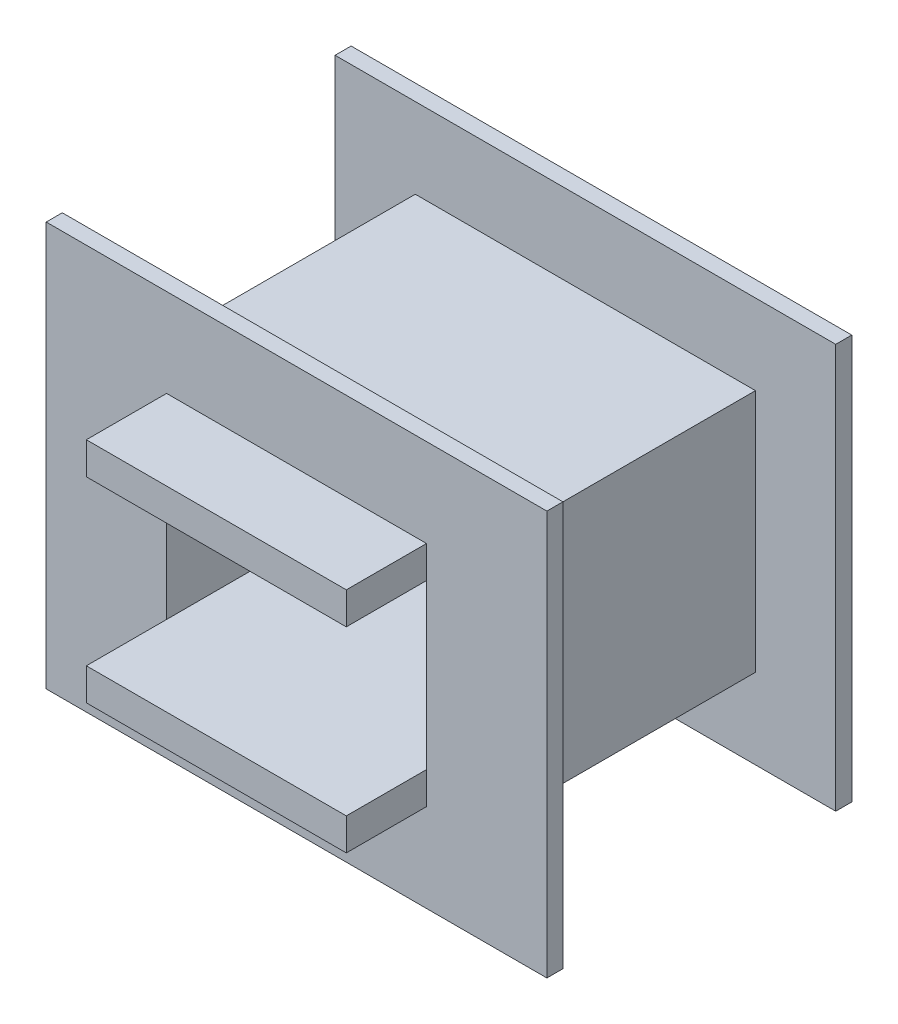
ISO-10303-21;
HEADER;
FILE_DESCRIPTION(('STEP AP214'),'2;1');
FILE_NAME('part.step','',(''),(''),'','','');
FILE_SCHEMA(('AUTOMOTIVE_DESIGN { 1 0 10303 214 1 1 1 1 }'));
ENDSEC;
DATA;
#1=APPLICATION_CONTEXT('core data for automotive mechanical design processes');
#2=APPLICATION_PROTOCOL_DEFINITION('international standard','automotive_design',2000,#1);
#3=PRODUCT_CONTEXT('',#1,'mechanical');
#4=PRODUCT('Part','Part','',(#3));
#5=PRODUCT_RELATED_PRODUCT_CATEGORY('part','',(#4));
#6=PRODUCT_DEFINITION_FORMATION('','',#4);
#7=PRODUCT_DEFINITION_CONTEXT('part definition',#1,'design');
#8=PRODUCT_DEFINITION('design','',#6,#7);
#9=PRODUCT_DEFINITION_SHAPE('','',#8);
#10=(LENGTH_UNIT() NAMED_UNIT(*) SI_UNIT(.MILLI.,.METRE.));
#11=(NAMED_UNIT(*) PLANE_ANGLE_UNIT() SI_UNIT($,.RADIAN.));
#12=(NAMED_UNIT(*) SI_UNIT($,.STERADIAN.) SOLID_ANGLE_UNIT());
#13=UNCERTAINTY_MEASURE_WITH_UNIT(LENGTH_MEASURE(1.E-05),#10,'distance_accuracy_value','');
#14=(GEOMETRIC_REPRESENTATION_CONTEXT(3) GLOBAL_UNCERTAINTY_ASSIGNED_CONTEXT((#13)) GLOBAL_UNIT_ASSIGNED_CONTEXT((#10,
#11,#12)) REPRESENTATION_CONTEXT('',''));
#15=CARTESIAN_POINT('',(0.,0.,0.));
#16=DIRECTION('',(0.,0.,1.));
#17=DIRECTION('',(1.,0.,0.));
#18=AXIS2_PLACEMENT_3D('',#15,#16,#17);
#19=CARTESIAN_POINT('',(-15.6,-12.6,9.5));
#20=DIRECTION('',(0.,0.,1.));
#21=DIRECTION('',(1.,0.,0.));
#22=AXIS2_PLACEMENT_3D('',#19,#20,#21);
#23=PLANE('',#22);
#24=DIRECTION('',(0.,-1.,0.));
#25=VECTOR('',#24,1.);
#26=CARTESIAN_POINT('',(-15.6,12.6,9.5));
#27=LINE('',#26,#25);
#28=CARTESIAN_POINT('',(-15.6,12.6,9.5));
#29=VERTEX_POINT('',#28);
#30=CARTESIAN_POINT('',(-15.6,-12.6,9.5));
#31=VERTEX_POINT('',#30);
#32=EDGE_CURVE('E274',#29,#31,#27,.T.);
#33=ORIENTED_EDGE('',*,*,#32,.T.);
#34=DIRECTION('',(1.,0.,0.));
#35=VECTOR('',#34,1.);
#36=CARTESIAN_POINT('',(-15.6,-12.6,9.5));
#37=LINE('',#36,#35);
#38=CARTESIAN_POINT('',(15.6,-12.6,9.5));
#39=VERTEX_POINT('',#38);
#40=EDGE_CURVE('E277',#31,#39,#37,.T.);
#41=ORIENTED_EDGE('',*,*,#40,.T.);
#42=DIRECTION('',(0.,1.,0.));
#43=VECTOR('',#42,1.);
#44=CARTESIAN_POINT('',(15.6,-12.6,9.5));
#45=LINE('',#44,#43);
#46=CARTESIAN_POINT('',(15.6,12.6,9.5));
#47=VERTEX_POINT('',#46);
#48=EDGE_CURVE('E232',#39,#47,#45,.T.);
#49=ORIENTED_EDGE('',*,*,#48,.T.);
#50=DIRECTION('',(-1.,0.,0.));
#51=VECTOR('',#50,1.);
#52=CARTESIAN_POINT('',(15.6,12.6,9.5));
#53=LINE('',#52,#51);
#54=EDGE_CURVE('E228',#47,#29,#53,.T.);
#55=ORIENTED_EDGE('',*,*,#54,.T.);
#56=EDGE_LOOP('',(#33,#41,#49,#55));
#57=FACE_BOUND('',#56,.T.);
#58=DIRECTION('',(0.,1.,0.));
#59=VECTOR('',#58,1.);
#60=CARTESIAN_POINT('',(8.1,-5.1,9.5));
#61=LINE('',#60,#59);
#62=CARTESIAN_POINT('',(8.1,-5.1,9.5));
#63=VERTEX_POINT('',#62);
#64=CARTESIAN_POINT('',(8.1,5.1,9.5));
#65=VERTEX_POINT('',#64);
#66=EDGE_CURVE('E285',#63,#65,#61,.T.);
#67=ORIENTED_EDGE('',*,*,#66,.F.);
#68=DIRECTION('',(0.,1.,0.));
#69=VECTOR('',#68,1.);
#70=CARTESIAN_POINT('',(8.1,-5.1,9.5));
#71=LINE('',#70,#69);
#72=CARTESIAN_POINT('',(8.1,-7.1,9.5));
#73=VERTEX_POINT('',#72);
#74=EDGE_CURVE('E327',#73,#63,#71,.T.);
#75=ORIENTED_EDGE('',*,*,#74,.F.);
#76=DIRECTION('',(1.,0.,0.));
#77=VECTOR('',#76,1.);
#78=CARTESIAN_POINT('',(8.1,-7.1,9.5));
#79=LINE('',#78,#77);
#80=CARTESIAN_POINT('',(-8.1,-7.1,9.5));
#81=VERTEX_POINT('',#80);
#82=EDGE_CURVE('E324',#81,#73,#79,.T.);
#83=ORIENTED_EDGE('',*,*,#82,.F.);
#84=DIRECTION('',(0.,-1.,0.));
#85=VECTOR('',#84,1.);
#86=CARTESIAN_POINT('',(-8.1,-5.1,9.5));
#87=LINE('',#86,#85);
#88=CARTESIAN_POINT('',(-8.1,-5.1,9.5));
#89=VERTEX_POINT('',#88);
#90=EDGE_CURVE('E322',#89,#81,#87,.T.);
#91=ORIENTED_EDGE('',*,*,#90,.F.);
#92=DIRECTION('',(0.,-1.,0.));
#93=VECTOR('',#92,1.);
#94=CARTESIAN_POINT('',(-8.1,5.1,9.5));
#95=LINE('',#94,#93);
#96=CARTESIAN_POINT('',(-8.1,5.1,9.5));
#97=VERTEX_POINT('',#96);
#98=EDGE_CURVE('E288',#97,#89,#95,.T.);
#99=ORIENTED_EDGE('',*,*,#98,.F.);
#100=DIRECTION('',(0.,-1.,0.));
#101=VECTOR('',#100,1.);
#102=CARTESIAN_POINT('',(-8.1,5.1,9.5));
#103=LINE('',#102,#101);
#104=CARTESIAN_POINT('',(-8.1,7.1,9.5));
#105=VERTEX_POINT('',#104);
#106=EDGE_CURVE('E318',#105,#97,#103,.T.);
#107=ORIENTED_EDGE('',*,*,#106,.F.);
#108=DIRECTION('',(-1.,0.,0.));
#109=VECTOR('',#108,1.);
#110=CARTESIAN_POINT('',(-8.1,7.1,9.5));
#111=LINE('',#110,#109);
#112=CARTESIAN_POINT('',(8.1,7.1,9.5));
#113=VERTEX_POINT('',#112);
#114=EDGE_CURVE('E382',#113,#105,#111,.T.);
#115=ORIENTED_EDGE('',*,*,#114,.F.);
#116=DIRECTION('',(0.,1.,0.));
#117=VECTOR('',#116,1.);
#118=CARTESIAN_POINT('',(8.1,5.1,9.5));
#119=LINE('',#118,#117);
#120=EDGE_CURVE('E390',#65,#113,#119,.T.);
#121=ORIENTED_EDGE('',*,*,#120,.F.);
#122=EDGE_LOOP('',(#67,#75,#83,#91,#99,#107,#115,#121));
#123=FACE_BOUND('',#122,.T.);
#124=ADVANCED_FACE('F31',(#57,#123),#23,.T.);
#125=CARTESIAN_POINT('',(-15.6,7.6,8.50000000000001));
#126=DIRECTION('',(0.,1.,0.));
#127=DIRECTION('',(-1.,0.,0.));
#128=AXIS2_PLACEMENT_3D('',#125,#126,#127);
#129=PLANE('',#128);
#130=DIRECTION('',(-1.,0.,0.));
#131=VECTOR('',#130,1.);
#132=CARTESIAN_POINT('',(-15.6,7.6,-8.5));
#133=LINE('',#132,#131);
#134=CARTESIAN_POINT('',(10.6,7.6,-8.5));
#135=VERTEX_POINT('',#134);
#136=CARTESIAN_POINT('',(-10.6,7.6,-8.5));
#137=VERTEX_POINT('',#136);
#138=EDGE_CURVE('E307',#135,#137,#133,.T.);
#139=ORIENTED_EDGE('',*,*,#138,.T.);
#140=DIRECTION('',(0.,0.,1.));
#141=VECTOR('',#140,1.);
#142=CARTESIAN_POINT('',(-10.6,7.6,8.50000000000001));
#143=LINE('',#142,#141);
#144=CARTESIAN_POINT('',(-10.6,7.6,8.50000000000001));
#145=VERTEX_POINT('',#144);
#146=EDGE_CURVE('E406',#137,#145,#143,.T.);
#147=ORIENTED_EDGE('',*,*,#146,.T.);
#148=DIRECTION('',(1.,0.,0.));
#149=VECTOR('',#148,1.);
#150=CARTESIAN_POINT('',(-15.6,7.6,8.50000000000001));
#151=LINE('',#150,#149);
#152=CARTESIAN_POINT('',(10.6,7.6,8.50000000000001));
#153=VERTEX_POINT('',#152);
#154=EDGE_CURVE('E302',#145,#153,#151,.T.);
#155=ORIENTED_EDGE('',*,*,#154,.T.);
#156=DIRECTION('',(0.,0.,1.));
#157=VECTOR('',#156,1.);
#158=CARTESIAN_POINT('',(10.6,7.6,8.50000000000001));
#159=LINE('',#158,#157);
#160=EDGE_CURVE('E422',#135,#153,#159,.T.);
#161=ORIENTED_EDGE('',*,*,#160,.F.);
#162=EDGE_LOOP('',(#139,#147,#155,#161));
#163=FACE_BOUND('',#162,.T.);
#164=ADVANCED_FACE('F436',(#163),#129,.T.);
#165=CARTESIAN_POINT('',(-15.6,-7.6,8.50000000000001));
#166=DIRECTION('',(0.,-1.,0.));
#167=DIRECTION('',(-1.,0.,0.));
#168=AXIS2_PLACEMENT_3D('',#165,#166,#167);
#169=PLANE('',#168);
#170=DIRECTION('',(1.,0.,0.));
#171=VECTOR('',#170,1.);
#172=CARTESIAN_POINT('',(-15.6,-7.6,8.50000000000001));
#173=LINE('',#172,#171);
#174=CARTESIAN_POINT('',(-10.6,-7.6,8.50000000000001));
#175=VERTEX_POINT('',#174);
#176=CARTESIAN_POINT('',(10.6,-7.6,8.50000000000001));
#177=VERTEX_POINT('',#176);
#178=EDGE_CURVE('E300',#175,#177,#173,.T.);
#179=ORIENTED_EDGE('',*,*,#178,.F.);
#180=DIRECTION('',(0.,0.,-1.));
#181=VECTOR('',#180,1.);
#182=CARTESIAN_POINT('',(-10.6,-7.6,8.50000000000001));
#183=LINE('',#182,#181);
#184=CARTESIAN_POINT('',(-10.6,-7.6,-8.5));
#185=VERTEX_POINT('',#184);
#186=EDGE_CURVE('E411',#175,#185,#183,.T.);
#187=ORIENTED_EDGE('',*,*,#186,.T.);
#188=DIRECTION('',(-1.,0.,0.));
#189=VECTOR('',#188,1.);
#190=CARTESIAN_POINT('',(-15.6,-7.6,-8.5));
#191=LINE('',#190,#189);
#192=CARTESIAN_POINT('',(10.6,-7.6,-8.5));
#193=VERTEX_POINT('',#192);
#194=EDGE_CURVE('E304',#193,#185,#191,.T.);
#195=ORIENTED_EDGE('',*,*,#194,.F.);
#196=DIRECTION('',(0.,0.,-1.));
#197=VECTOR('',#196,1.);
#198=CARTESIAN_POINT('',(10.6,-7.6,8.50000000000001));
#199=LINE('',#198,#197);
#200=EDGE_CURVE('E417',#177,#193,#199,.T.);
#201=ORIENTED_EDGE('',*,*,#200,.F.);
#202=EDGE_LOOP('',(#179,#187,#195,#201));
#203=FACE_BOUND('',#202,.T.);
#204=ADVANCED_FACE('F448',(#203),#169,.T.);
#205=CARTESIAN_POINT('',(-15.6,12.6,-9.5));
#206=DIRECTION('',(-1.,0.,0.));
#207=DIRECTION('',(0.,0.,1.));
#208=AXIS2_PLACEMENT_3D('',#205,#206,#207);
#209=PLANE('',#208);
#210=DIRECTION('',(0.,1.,0.));
#211=VECTOR('',#210,1.);
#212=CARTESIAN_POINT('',(-15.6,7.6,8.50000000000001));
#213=LINE('',#212,#211);
#214=CARTESIAN_POINT('',(-15.6,-12.6,8.50000000000001));
#215=VERTEX_POINT('',#214);
#216=CARTESIAN_POINT('',(-15.6,12.6,8.50000000000001));
#217=VERTEX_POINT('',#216);
#218=EDGE_CURVE('E275',#215,#217,#213,.T.);
#219=ORIENTED_EDGE('',*,*,#218,.F.);
#220=DIRECTION('',(0.,0.,1.));
#221=VECTOR('',#220,1.);
#222=CARTESIAN_POINT('',(-15.6,-12.6,-9.5));
#223=LINE('',#222,#221);
#224=EDGE_CURVE('E251',#215,#31,#223,.T.);
#225=ORIENTED_EDGE('',*,*,#224,.T.);
#226=ORIENTED_EDGE('',*,*,#32,.F.);
#227=DIRECTION('',(0.,0.,1.));
#228=VECTOR('',#227,1.);
#229=CARTESIAN_POINT('',(-15.6,12.6,-9.5));
#230=LINE('',#229,#228);
#231=EDGE_CURVE('E40',#217,#29,#230,.T.);
#232=ORIENTED_EDGE('',*,*,#231,.F.);
#233=EDGE_LOOP('',(#219,#225,#226,#232));
#234=FACE_BOUND('',#233,.T.);
#235=ADVANCED_FACE('F33',(#234),#209,.T.);
#236=CARTESIAN_POINT('',(-15.6,-12.6,-9.5));
#237=VERTEX_POINT('',#236);
#238=CARTESIAN_POINT('',(-15.6,-12.6,-8.5));
#239=VERTEX_POINT('',#238);
#240=EDGE_CURVE('E35',#237,#239,#223,.T.);
#241=ORIENTED_EDGE('',*,*,#240,.T.);
#242=DIRECTION('',(0.,1.,0.));
#243=VECTOR('',#242,1.);
#244=CARTESIAN_POINT('',(-15.6,7.6,-8.5));
#245=LINE('',#244,#243);
#246=CARTESIAN_POINT('',(-15.6,12.6,-8.5));
#247=VERTEX_POINT('',#246);
#248=EDGE_CURVE('E310',#239,#247,#245,.T.);
#249=ORIENTED_EDGE('',*,*,#248,.T.);
#250=CARTESIAN_POINT('',(-15.6,12.6,-9.5));
#251=VERTEX_POINT('',#250);
#252=EDGE_CURVE('E11',#251,#247,#230,.T.);
#253=ORIENTED_EDGE('',*,*,#252,.F.);
#254=DIRECTION('',(0.,-1.,0.));
#255=VECTOR('',#254,1.);
#256=CARTESIAN_POINT('',(-15.6,12.6,-9.5));
#257=LINE('',#256,#255);
#258=EDGE_CURVE('E222',#251,#237,#257,.T.);
#259=ORIENTED_EDGE('',*,*,#258,.T.);
#260=EDGE_LOOP('',(#241,#249,#253,#259));
#261=FACE_BOUND('',#260,.T.);
#262=ADVANCED_FACE('F506',(#261),#209,.T.);
#263=CARTESIAN_POINT('',(15.6,-12.6,-9.5));
#264=DIRECTION('',(1.,0.,0.));
#265=DIRECTION('',(0.,0.,-1.));
#266=AXIS2_PLACEMENT_3D('',#263,#264,#265);
#267=PLANE('',#266);
#268=DIRECTION('',(0.,0.,1.));
#269=VECTOR('',#268,1.);
#270=CARTESIAN_POINT('',(15.6,-12.6,-9.5));
#271=LINE('',#270,#269);
#272=CARTESIAN_POINT('',(15.6,-12.6,8.50000000000001));
#273=VERTEX_POINT('',#272);
#274=EDGE_CURVE('E258',#273,#39,#271,.T.);
#275=ORIENTED_EDGE('',*,*,#274,.F.);
#276=DIRECTION('',(0.,1.,0.));
#277=VECTOR('',#276,1.);
#278=CARTESIAN_POINT('',(15.6,7.6,8.50000000000001));
#279=LINE('',#278,#277);
#280=CARTESIAN_POINT('',(15.6,12.6,8.50000000000001));
#281=VERTEX_POINT('',#280);
#282=EDGE_CURVE('E314',#273,#281,#279,.T.);
#283=ORIENTED_EDGE('',*,*,#282,.T.);
#284=DIRECTION('',(0.,0.,1.));
#285=VECTOR('',#284,1.);
#286=CARTESIAN_POINT('',(15.6,12.6,-9.5));
#287=LINE('',#286,#285);
#288=EDGE_CURVE('E255',#281,#47,#287,.T.);
#289=ORIENTED_EDGE('',*,*,#288,.T.);
#290=ORIENTED_EDGE('',*,*,#48,.F.);
#291=EDGE_LOOP('',(#275,#283,#289,#290));
#292=FACE_BOUND('',#291,.T.);
#293=ADVANCED_FACE('F486',(#292),#267,.T.);
#294=DIRECTION('',(0.,1.,0.));
#295=VECTOR('',#294,1.);
#296=CARTESIAN_POINT('',(15.6,7.6,-8.5));
#297=LINE('',#296,#295);
#298=CARTESIAN_POINT('',(15.6,-12.6,-8.5));
#299=VERTEX_POINT('',#298);
#300=CARTESIAN_POINT('',(15.6,12.6,-8.5));
#301=VERTEX_POINT('',#300);
#302=EDGE_CURVE('E312',#299,#301,#297,.T.);
#303=ORIENTED_EDGE('',*,*,#302,.F.);
#304=CARTESIAN_POINT('',(15.6,-12.6,-9.5));
#305=VERTEX_POINT('',#304);
#306=EDGE_CURVE('E256',#305,#299,#271,.T.);
#307=ORIENTED_EDGE('',*,*,#306,.F.);
#308=DIRECTION('',(0.,1.,0.));
#309=VECTOR('',#308,1.);
#310=CARTESIAN_POINT('',(15.6,-12.6,-9.5));
#311=LINE('',#310,#309);
#312=CARTESIAN_POINT('',(15.6,12.6,-9.5));
#313=VERTEX_POINT('',#312);
#314=EDGE_CURVE('E246',#305,#313,#311,.T.);
#315=ORIENTED_EDGE('',*,*,#314,.T.);
#316=EDGE_CURVE('E253',#313,#301,#287,.T.);
#317=ORIENTED_EDGE('',*,*,#316,.T.);
#318=EDGE_LOOP('',(#303,#307,#315,#317));
#319=FACE_BOUND('',#318,.T.);
#320=ADVANCED_FACE('F484',(#319),#267,.T.);
#321=CARTESIAN_POINT('',(-15.6,-12.6,-9.5));
#322=DIRECTION('',(0.,-1.,0.));
#323=DIRECTION('',(1.,0.,0.));
#324=AXIS2_PLACEMENT_3D('',#321,#322,#323);
#325=PLANE('',#324);
#326=ORIENTED_EDGE('',*,*,#224,.F.);
#327=DIRECTION('',(1.,0.,0.));
#328=VECTOR('',#327,1.);
#329=CARTESIAN_POINT('',(-15.6,-12.6,8.50000000000001));
#330=LINE('',#329,#328);
#331=EDGE_CURVE('E427',#215,#273,#330,.T.);
#332=ORIENTED_EDGE('',*,*,#331,.T.);
#333=ORIENTED_EDGE('',*,*,#274,.T.);
#334=ORIENTED_EDGE('',*,*,#40,.F.);
#335=EDGE_LOOP('',(#326,#332,#333,#334));
#336=FACE_BOUND('',#335,.T.);
#337=ADVANCED_FACE('F278',(#336),#325,.T.);
#338=ORIENTED_EDGE('',*,*,#306,.T.);
#339=DIRECTION('',(-1.,0.,0.));
#340=VECTOR('',#339,1.);
#341=CARTESIAN_POINT('',(-15.6,-12.6,-8.5));
#342=LINE('',#341,#340);
#343=EDGE_CURVE('E425',#299,#239,#342,.T.);
#344=ORIENTED_EDGE('',*,*,#343,.T.);
#345=ORIENTED_EDGE('',*,*,#240,.F.);
#346=DIRECTION('',(1.,0.,0.));
#347=VECTOR('',#346,1.);
#348=CARTESIAN_POINT('',(-15.6,-12.6,-9.5));
#349=LINE('',#348,#347);
#350=EDGE_CURVE('E243',#237,#305,#349,.T.);
#351=ORIENTED_EDGE('',*,*,#350,.T.);
#352=EDGE_LOOP('',(#338,#344,#345,#351));
#353=FACE_BOUND('',#352,.T.);
#354=ADVANCED_FACE('F489',(#353),#325,.T.);
#355=CARTESIAN_POINT('',(15.6,12.6,-9.5));
#356=DIRECTION('',(0.,1.,0.));
#357=DIRECTION('',(-1.,0.,0.));
#358=AXIS2_PLACEMENT_3D('',#355,#356,#357);
#359=PLANE('',#358);
#360=DIRECTION('',(-1.,0.,0.));
#361=VECTOR('',#360,1.);
#362=CARTESIAN_POINT('',(-15.6,12.6,-8.5));
#363=LINE('',#362,#361);
#364=EDGE_CURVE('E299',#301,#247,#363,.T.);
#365=ORIENTED_EDGE('',*,*,#364,.F.);
#366=ORIENTED_EDGE('',*,*,#316,.F.);
#367=DIRECTION('',(-1.,0.,0.));
#368=VECTOR('',#367,1.);
#369=CARTESIAN_POINT('',(15.6,12.6,-9.5));
#370=LINE('',#369,#368);
#371=EDGE_CURVE('E249',#313,#251,#370,.T.);
#372=ORIENTED_EDGE('',*,*,#371,.T.);
#373=ORIENTED_EDGE('',*,*,#252,.T.);
#374=EDGE_LOOP('',(#365,#366,#372,#373));
#375=FACE_BOUND('',#374,.T.);
#376=ADVANCED_FACE('F483',(#375),#359,.T.);
#377=DIRECTION('',(1.,0.,0.));
#378=VECTOR('',#377,1.);
#379=CARTESIAN_POINT('',(-15.6,12.6,8.50000000000001));
#380=LINE('',#379,#378);
#381=EDGE_CURVE('E296',#217,#281,#380,.T.);
#382=ORIENTED_EDGE('',*,*,#381,.F.);
#383=ORIENTED_EDGE('',*,*,#231,.T.);
#384=ORIENTED_EDGE('',*,*,#54,.F.);
#385=ORIENTED_EDGE('',*,*,#288,.F.);
#386=EDGE_LOOP('',(#382,#383,#384,#385));
#387=FACE_BOUND('',#386,.T.);
#388=ADVANCED_FACE('F295',(#387),#359,.T.);
#389=CARTESIAN_POINT('',(-15.6,-12.6,-9.5));
#390=DIRECTION('',(0.,0.,1.));
#391=DIRECTION('',(1.,0.,0.));
#392=AXIS2_PLACEMENT_3D('',#389,#390,#391);
#393=PLANE('',#392);
#394=DIRECTION('',(1.,0.,0.));
#395=VECTOR('',#394,1.);
#396=CARTESIAN_POINT('',(-8.1,5.1,-9.5));
#397=LINE('',#396,#395);
#398=CARTESIAN_POINT('',(-8.1,5.1,-9.5));
#399=VERTEX_POINT('',#398);
#400=CARTESIAN_POINT('',(8.1,5.1,-9.5));
#401=VERTEX_POINT('',#400);
#402=EDGE_CURVE('E199',#399,#401,#397,.T.);
#403=ORIENTED_EDGE('',*,*,#402,.F.);
#404=DIRECTION('',(0.,-1.,0.));
#405=VECTOR('',#404,1.);
#406=CARTESIAN_POINT('',(-8.1,5.1,-9.5));
#407=LINE('',#406,#405);
#408=CARTESIAN_POINT('',(-8.1,-5.1,-9.5));
#409=VERTEX_POINT('',#408);
#410=EDGE_CURVE('E204',#399,#409,#407,.T.);
#411=ORIENTED_EDGE('',*,*,#410,.T.);
#412=DIRECTION('',(0.,-1.,0.));
#413=VECTOR('',#412,1.);
#414=CARTESIAN_POINT('',(-8.1,-5.1,-9.5));
#415=LINE('',#414,#413);
#416=CARTESIAN_POINT('',(-8.1,-7.1,-9.5));
#417=VERTEX_POINT('',#416);
#418=EDGE_CURVE('E53',#409,#417,#415,.T.);
#419=ORIENTED_EDGE('',*,*,#418,.T.);
#420=DIRECTION('',(1.,0.,0.));
#421=VECTOR('',#420,1.);
#422=CARTESIAN_POINT('',(8.1,-7.1,-9.5));
#423=LINE('',#422,#421);
#424=CARTESIAN_POINT('',(8.1,-7.1,-9.5));
#425=VERTEX_POINT('',#424);
#426=EDGE_CURVE('E48',#417,#425,#423,.T.);
#427=ORIENTED_EDGE('',*,*,#426,.T.);
#428=DIRECTION('',(0.,1.,0.));
#429=VECTOR('',#428,1.);
#430=CARTESIAN_POINT('',(8.1,-5.1,-9.5));
#431=LINE('',#430,#429);
#432=CARTESIAN_POINT('',(8.1,-5.1,-9.5));
#433=VERTEX_POINT('',#432);
#434=EDGE_CURVE('E211',#425,#433,#431,.T.);
#435=ORIENTED_EDGE('',*,*,#434,.T.);
#436=DIRECTION('',(0.,1.,0.));
#437=VECTOR('',#436,1.);
#438=CARTESIAN_POINT('',(8.1,-5.1,-9.5));
#439=LINE('',#438,#437);
#440=EDGE_CURVE('E207',#433,#401,#439,.T.);
#441=ORIENTED_EDGE('',*,*,#440,.T.);
#442=EDGE_LOOP('',(#403,#411,#419,#427,#435,#441));
#443=FACE_BOUND('',#442,.T.);
#444=ORIENTED_EDGE('',*,*,#258,.F.);
#445=ORIENTED_EDGE('',*,*,#371,.F.);
#446=ORIENTED_EDGE('',*,*,#314,.F.);
#447=ORIENTED_EDGE('',*,*,#350,.F.);
#448=EDGE_LOOP('',(#444,#445,#446,#447));
#449=FACE_BOUND('',#448,.T.);
#450=ADVANCED_FACE('F201',(#443,#449),#393,.F.);
#451=CARTESIAN_POINT('',(-8.1,5.1,-9.5));
#452=DIRECTION('',(-1.,0.,0.));
#453=DIRECTION('',(0.,0.,1.));
#454=AXIS2_PLACEMENT_3D('',#451,#452,#453);
#455=PLANE('',#454);
#456=DIRECTION('',(0.,0.,1.));
#457=VECTOR('',#456,1.);
#458=CARTESIAN_POINT('',(-8.1,5.1,-9.5));
#459=LINE('',#458,#457);
#460=EDGE_CURVE('E214',#399,#97,#459,.T.);
#461=ORIENTED_EDGE('',*,*,#460,.T.);
#462=ORIENTED_EDGE('',*,*,#98,.T.);
#463=DIRECTION('',(0.,0.,1.));
#464=VECTOR('',#463,1.);
#465=CARTESIAN_POINT('',(-8.1,-5.1,-9.5));
#466=LINE('',#465,#464);
#467=EDGE_CURVE('E227',#409,#89,#466,.T.);
#468=ORIENTED_EDGE('',*,*,#467,.F.);
#469=ORIENTED_EDGE('',*,*,#410,.F.);
#470=EDGE_LOOP('',(#461,#462,#468,#469));
#471=FACE_BOUND('',#470,.T.);
#472=ADVANCED_FACE('F225',(#471),#455,.F.);
#473=CARTESIAN_POINT('',(8.1,5.1,-9.5));
#474=DIRECTION('',(0.,1.,0.));
#475=DIRECTION('',(-1.,0.,0.));
#476=AXIS2_PLACEMENT_3D('',#473,#474,#475);
#477=PLANE('',#476);
#478=ORIENTED_EDGE('',*,*,#460,.F.);
#479=ORIENTED_EDGE('',*,*,#402,.T.);
#480=DIRECTION('',(0.,0.,1.));
#481=VECTOR('',#480,1.);
#482=CARTESIAN_POINT('',(8.1,5.1,-9.5));
#483=LINE('',#482,#481);
#484=EDGE_CURVE('E223',#401,#65,#483,.T.);
#485=ORIENTED_EDGE('',*,*,#484,.T.);
#486=DIRECTION('',(0.,0.,-1.));
#487=VECTOR('',#486,1.);
#488=CARTESIAN_POINT('',(8.1,5.1,14.5));
#489=LINE('',#488,#487);
#490=CARTESIAN_POINT('',(8.1,5.1,14.5));
#491=VERTEX_POINT('',#490);
#492=EDGE_CURVE('E399',#491,#65,#489,.T.);
#493=ORIENTED_EDGE('',*,*,#492,.F.);
#494=DIRECTION('',(1.,0.,0.));
#495=VECTOR('',#494,1.);
#496=CARTESIAN_POINT('',(-8.1,5.1,14.5));
#497=LINE('',#496,#495);
#498=CARTESIAN_POINT('',(-8.1,5.1,14.5));
#499=VERTEX_POINT('',#498);
#500=EDGE_CURVE('E381',#499,#491,#497,.T.);
#501=ORIENTED_EDGE('',*,*,#500,.F.);
#502=DIRECTION('',(0.,0.,-1.));
#503=VECTOR('',#502,1.);
#504=CARTESIAN_POINT('',(-8.1,5.1,14.5));
#505=LINE('',#504,#503);
#506=EDGE_CURVE('E217',#499,#97,#505,.T.);
#507=ORIENTED_EDGE('',*,*,#506,.T.);
#508=EDGE_LOOP('',(#478,#479,#485,#493,#501,#507));
#509=FACE_BOUND('',#508,.T.);
#510=ADVANCED_FACE('F215',(#509),#477,.F.);
#511=CARTESIAN_POINT('',(8.1,-5.1,-9.5));
#512=DIRECTION('',(1.,0.,0.));
#513=DIRECTION('',(0.,0.,-1.));
#514=AXIS2_PLACEMENT_3D('',#511,#512,#513);
#515=PLANE('',#514);
#516=DIRECTION('',(0.,0.,1.));
#517=VECTOR('',#516,1.);
#518=CARTESIAN_POINT('',(8.1,-5.1,-9.5));
#519=LINE('',#518,#517);
#520=EDGE_CURVE('E237',#433,#63,#519,.T.);
#521=ORIENTED_EDGE('',*,*,#520,.T.);
#522=ORIENTED_EDGE('',*,*,#66,.T.);
#523=ORIENTED_EDGE('',*,*,#484,.F.);
#524=ORIENTED_EDGE('',*,*,#440,.F.);
#525=EDGE_LOOP('',(#521,#522,#523,#524));
#526=FACE_BOUND('',#525,.T.);
#527=ADVANCED_FACE('F471',(#526),#515,.F.);
#528=CARTESIAN_POINT('',(-8.1,-5.1,-9.5));
#529=DIRECTION('',(0.,-1.,0.));
#530=DIRECTION('',(1.,0.,0.));
#531=AXIS2_PLACEMENT_3D('',#528,#529,#530);
#532=PLANE('',#531);
#533=ORIENTED_EDGE('',*,*,#467,.T.);
#534=DIRECTION('',(0.,0.,-1.));
#535=VECTOR('',#534,1.);
#536=CARTESIAN_POINT('',(-8.1,-5.1,14.5));
#537=LINE('',#536,#535);
#538=CARTESIAN_POINT('',(-8.1,-5.1,14.5));
#539=VERTEX_POINT('',#538);
#540=EDGE_CURVE('E332',#539,#89,#537,.T.);
#541=ORIENTED_EDGE('',*,*,#540,.F.);
#542=DIRECTION('',(-1.,0.,0.));
#543=VECTOR('',#542,1.);
#544=CARTESIAN_POINT('',(8.1,-5.1,14.5));
#545=LINE('',#544,#543);
#546=CARTESIAN_POINT('',(8.1,-5.1,14.5));
#547=VERTEX_POINT('',#546);
#548=EDGE_CURVE('E361',#547,#539,#545,.T.);
#549=ORIENTED_EDGE('',*,*,#548,.F.);
#550=DIRECTION('',(0.,0.,-1.));
#551=VECTOR('',#550,1.);
#552=CARTESIAN_POINT('',(8.1,-5.1,14.5));
#553=LINE('',#552,#551);
#554=EDGE_CURVE('E376',#547,#63,#553,.T.);
#555=ORIENTED_EDGE('',*,*,#554,.T.);
#556=ORIENTED_EDGE('',*,*,#520,.F.);
#557=DIRECTION('',(0.,0.,1.));
#558=VECTOR('',#557,1.);
#559=CARTESIAN_POINT('',(8.1,-5.1,-14.5));
#560=LINE('',#559,#558);
#561=CARTESIAN_POINT('',(8.1,-5.1,-14.5));
#562=VERTEX_POINT('',#561);
#563=EDGE_CURVE('E342',#562,#433,#560,.T.);
#564=ORIENTED_EDGE('',*,*,#563,.F.);
#565=DIRECTION('',(-1.,0.,0.));
#566=VECTOR('',#565,1.);
#567=CARTESIAN_POINT('',(8.1,-5.1,-14.5));
#568=LINE('',#567,#566);
#569=CARTESIAN_POINT('',(-8.1,-5.1,-14.5));
#570=VERTEX_POINT('',#569);
#571=EDGE_CURVE('E337',#562,#570,#568,.T.);
#572=ORIENTED_EDGE('',*,*,#571,.T.);
#573=DIRECTION('',(0.,0.,1.));
#574=VECTOR('',#573,1.);
#575=CARTESIAN_POINT('',(-8.1,-5.1,-14.5));
#576=LINE('',#575,#574);
#577=EDGE_CURVE('E335',#570,#409,#576,.T.);
#578=ORIENTED_EDGE('',*,*,#577,.T.);
#579=EDGE_LOOP('',(#533,#541,#549,#555,#556,#564,#572,#578));
#580=FACE_BOUND('',#579,.T.);
#581=ADVANCED_FACE('F331',(#580),#532,.F.);
#582=CARTESIAN_POINT('',(-15.6,7.6,-8.5));
#583=DIRECTION('',(0.,0.,-1.));
#584=DIRECTION('',(-1.,0.,0.));
#585=AXIS2_PLACEMENT_3D('',#582,#583,#584);
#586=PLANE('',#585);
#587=ORIENTED_EDGE('',*,*,#248,.F.);
#588=ORIENTED_EDGE('',*,*,#343,.F.);
#589=ORIENTED_EDGE('',*,*,#302,.T.);
#590=ORIENTED_EDGE('',*,*,#364,.T.);
#591=EDGE_LOOP('',(#587,#588,#589,#590));
#592=FACE_BOUND('',#591,.T.);
#593=ORIENTED_EDGE('',*,*,#194,.T.);
#594=DIRECTION('',(0.,1.,0.));
#595=VECTOR('',#594,1.);
#596=CARTESIAN_POINT('',(-10.6,7.6,-8.5));
#597=LINE('',#596,#595);
#598=EDGE_CURVE('E409',#185,#137,#597,.T.);
#599=ORIENTED_EDGE('',*,*,#598,.T.);
#600=ORIENTED_EDGE('',*,*,#138,.F.);
#601=DIRECTION('',(0.,1.,0.));
#602=VECTOR('',#601,1.);
#603=CARTESIAN_POINT('',(10.6,7.6,-8.5));
#604=LINE('',#603,#602);
#605=EDGE_CURVE('E420',#193,#135,#604,.T.);
#606=ORIENTED_EDGE('',*,*,#605,.F.);
#607=EDGE_LOOP('',(#593,#599,#600,#606));
#608=FACE_BOUND('',#607,.T.);
#609=ADVANCED_FACE('F439',(#592,#608),#586,.F.);
#610=CARTESIAN_POINT('',(-15.6,7.6,8.50000000000001));
#611=DIRECTION('',(0.,0.,1.));
#612=DIRECTION('',(1.,0.,0.));
#613=AXIS2_PLACEMENT_3D('',#610,#611,#612);
#614=PLANE('',#613);
#615=DIRECTION('',(0.,-1.,0.));
#616=VECTOR('',#615,1.);
#617=CARTESIAN_POINT('',(-10.6,7.6,8.50000000000001));
#618=LINE('',#617,#616);
#619=EDGE_CURVE('E403',#145,#175,#618,.T.);
#620=ORIENTED_EDGE('',*,*,#619,.T.);
#621=ORIENTED_EDGE('',*,*,#178,.T.);
#622=DIRECTION('',(0.,-1.,0.));
#623=VECTOR('',#622,1.);
#624=CARTESIAN_POINT('',(10.6,7.6,8.50000000000001));
#625=LINE('',#624,#623);
#626=EDGE_CURVE('E414',#153,#177,#625,.T.);
#627=ORIENTED_EDGE('',*,*,#626,.F.);
#628=ORIENTED_EDGE('',*,*,#154,.F.);
#629=EDGE_LOOP('',(#620,#621,#627,#628));
#630=FACE_BOUND('',#629,.T.);
#631=ORIENTED_EDGE('',*,*,#381,.T.);
#632=ORIENTED_EDGE('',*,*,#282,.F.);
#633=ORIENTED_EDGE('',*,*,#331,.F.);
#634=ORIENTED_EDGE('',*,*,#218,.T.);
#635=EDGE_LOOP('',(#631,#632,#633,#634));
#636=FACE_BOUND('',#635,.T.);
#637=ADVANCED_FACE('F445',(#630,#636),#614,.F.);
#638=CARTESIAN_POINT('',(10.6,-7.6,8.50000000000001));
#639=DIRECTION('',(1.,0.,0.));
#640=DIRECTION('',(0.,0.,-1.));
#641=AXIS2_PLACEMENT_3D('',#638,#639,#640);
#642=PLANE('',#641);
#643=ORIENTED_EDGE('',*,*,#626,.T.);
#644=ORIENTED_EDGE('',*,*,#200,.T.);
#645=ORIENTED_EDGE('',*,*,#605,.T.);
#646=ORIENTED_EDGE('',*,*,#160,.T.);
#647=EDGE_LOOP('',(#643,#644,#645,#646));
#648=FACE_BOUND('',#647,.T.);
#649=ADVANCED_FACE('F450',(#648),#642,.T.);
#650=CARTESIAN_POINT('',(-10.6,-7.6,8.50000000000001));
#651=DIRECTION('',(-1.,0.,0.));
#652=DIRECTION('',(0.,0.,-1.));
#653=AXIS2_PLACEMENT_3D('',#650,#651,#652);
#654=PLANE('',#653);
#655=ORIENTED_EDGE('',*,*,#619,.F.);
#656=ORIENTED_EDGE('',*,*,#146,.F.);
#657=ORIENTED_EDGE('',*,*,#598,.F.);
#658=ORIENTED_EDGE('',*,*,#186,.F.);
#659=EDGE_LOOP('',(#655,#656,#657,#658));
#660=FACE_BOUND('',#659,.T.);
#661=ADVANCED_FACE('F442',(#660),#654,.T.);
#662=CARTESIAN_POINT('',(-8.1,5.1,14.5));
#663=DIRECTION('',(1.,0.,0.));
#664=DIRECTION('',(0.,0.,-1.));
#665=AXIS2_PLACEMENT_3D('',#662,#663,#664);
#666=PLANE('',#665);
#667=ORIENTED_EDGE('',*,*,#106,.T.);
#668=ORIENTED_EDGE('',*,*,#506,.F.);
#669=DIRECTION('',(0.,-1.,0.));
#670=VECTOR('',#669,1.);
#671=CARTESIAN_POINT('',(-8.1,5.1,14.5));
#672=LINE('',#671,#670);
#673=CARTESIAN_POINT('',(-8.1,7.1,14.5));
#674=VERTEX_POINT('',#673);
#675=EDGE_CURVE('E378',#674,#499,#672,.T.);
#676=ORIENTED_EDGE('',*,*,#675,.F.);
#677=DIRECTION('',(0.,0.,-1.));
#678=VECTOR('',#677,1.);
#679=CARTESIAN_POINT('',(-8.1,7.1,14.5));
#680=LINE('',#679,#678);
#681=EDGE_CURVE('E388',#674,#105,#680,.T.);
#682=ORIENTED_EDGE('',*,*,#681,.T.);
#683=EDGE_LOOP('',(#667,#668,#676,#682));
#684=FACE_BOUND('',#683,.T.);
#685=ADVANCED_FACE('F457',(#684),#666,.F.);
#686=CARTESIAN_POINT('',(8.1,5.1,14.5));
#687=DIRECTION('',(-1.,0.,0.));
#688=DIRECTION('',(0.,0.,1.));
#689=AXIS2_PLACEMENT_3D('',#686,#687,#688);
#690=PLANE('',#689);
#691=ORIENTED_EDGE('',*,*,#120,.T.);
#692=DIRECTION('',(0.,0.,-1.));
#693=VECTOR('',#692,1.);
#694=CARTESIAN_POINT('',(8.1,7.1,14.5));
#695=LINE('',#694,#693);
#696=CARTESIAN_POINT('',(8.1,7.1,14.5));
#697=VERTEX_POINT('',#696);
#698=EDGE_CURVE('E396',#697,#113,#695,.T.);
#699=ORIENTED_EDGE('',*,*,#698,.F.);
#700=DIRECTION('',(0.,1.,0.));
#701=VECTOR('',#700,1.);
#702=CARTESIAN_POINT('',(8.1,5.1,14.5));
#703=LINE('',#702,#701);
#704=EDGE_CURVE('E384',#491,#697,#703,.T.);
#705=ORIENTED_EDGE('',*,*,#704,.F.);
#706=ORIENTED_EDGE('',*,*,#492,.T.);
#707=EDGE_LOOP('',(#691,#699,#705,#706));
#708=FACE_BOUND('',#707,.T.);
#709=ADVANCED_FACE('F581',(#708),#690,.F.);
#710=CARTESIAN_POINT('',(-8.1,7.1,14.5));
#711=DIRECTION('',(0.,-1.,0.));
#712=DIRECTION('',(0.,0.,-1.));
#713=AXIS2_PLACEMENT_3D('',#710,#711,#712);
#714=PLANE('',#713);
#715=ORIENTED_EDGE('',*,*,#114,.T.);
#716=ORIENTED_EDGE('',*,*,#681,.F.);
#717=DIRECTION('',(-1.,0.,0.));
#718=VECTOR('',#717,1.);
#719=CARTESIAN_POINT('',(-8.1,7.1,14.5));
#720=LINE('',#719,#718);
#721=EDGE_CURVE('E386',#697,#674,#720,.T.);
#722=ORIENTED_EDGE('',*,*,#721,.F.);
#723=ORIENTED_EDGE('',*,*,#698,.T.);
#724=EDGE_LOOP('',(#715,#716,#722,#723));
#725=FACE_BOUND('',#724,.T.);
#726=ADVANCED_FACE('F592',(#725),#714,.F.);
#727=CARTESIAN_POINT('',(-8.1,7.1,14.5));
#728=DIRECTION('',(0.,0.,-1.));
#729=DIRECTION('',(-1.,0.,0.));
#730=AXIS2_PLACEMENT_3D('',#727,#728,#729);
#731=PLANE('',#730);
#732=ORIENTED_EDGE('',*,*,#675,.T.);
#733=ORIENTED_EDGE('',*,*,#500,.T.);
#734=ORIENTED_EDGE('',*,*,#704,.T.);
#735=ORIENTED_EDGE('',*,*,#721,.T.);
#736=EDGE_LOOP('',(#732,#733,#734,#735));
#737=FACE_BOUND('',#736,.T.);
#738=ADVANCED_FACE('F602',(#737),#731,.F.);
#739=CARTESIAN_POINT('',(8.1,-5.1,14.5));
#740=DIRECTION('',(-1.,0.,0.));
#741=DIRECTION('',(0.,0.,1.));
#742=AXIS2_PLACEMENT_3D('',#739,#740,#741);
#743=PLANE('',#742);
#744=ORIENTED_EDGE('',*,*,#74,.T.);
#745=ORIENTED_EDGE('',*,*,#554,.F.);
#746=DIRECTION('',(0.,1.,0.));
#747=VECTOR('',#746,1.);
#748=CARTESIAN_POINT('',(8.1,-5.1,14.5));
#749=LINE('',#748,#747);
#750=CARTESIAN_POINT('',(8.1,-7.1,14.5));
#751=VERTEX_POINT('',#750);
#752=EDGE_CURVE('E358',#751,#547,#749,.T.);
#753=ORIENTED_EDGE('',*,*,#752,.F.);
#754=DIRECTION('',(0.,0.,-1.));
#755=VECTOR('',#754,1.);
#756=CARTESIAN_POINT('',(8.1,-7.1,14.5));
#757=LINE('',#756,#755);
#758=EDGE_CURVE('E367',#751,#73,#757,.T.);
#759=ORIENTED_EDGE('',*,*,#758,.T.);
#760=EDGE_LOOP('',(#744,#745,#753,#759));
#761=FACE_BOUND('',#760,.T.);
#762=ADVANCED_FACE('F612',(#761),#743,.F.);
#763=CARTESIAN_POINT('',(-8.1,-5.1,14.5));
#764=DIRECTION('',(1.,0.,0.));
#765=DIRECTION('',(0.,0.,-1.));
#766=AXIS2_PLACEMENT_3D('',#763,#764,#765);
#767=PLANE('',#766);
#768=ORIENTED_EDGE('',*,*,#90,.T.);
#769=DIRECTION('',(0.,0.,-1.));
#770=VECTOR('',#769,1.);
#771=CARTESIAN_POINT('',(-8.1,-7.1,14.5));
#772=LINE('',#771,#770);
#773=CARTESIAN_POINT('',(-8.1,-7.1,14.5));
#774=VERTEX_POINT('',#773);
#775=EDGE_CURVE('E373',#774,#81,#772,.T.);
#776=ORIENTED_EDGE('',*,*,#775,.F.);
#777=DIRECTION('',(0.,-1.,0.));
#778=VECTOR('',#777,1.);
#779=CARTESIAN_POINT('',(-8.1,-5.1,14.5));
#780=LINE('',#779,#778);
#781=EDGE_CURVE('E363',#539,#774,#780,.T.);
#782=ORIENTED_EDGE('',*,*,#781,.F.);
#783=ORIENTED_EDGE('',*,*,#540,.T.);
#784=EDGE_LOOP('',(#768,#776,#782,#783));
#785=FACE_BOUND('',#784,.T.);
#786=ADVANCED_FACE('F622',(#785),#767,.F.);
#787=CARTESIAN_POINT('',(8.1,-7.1,14.5));
#788=DIRECTION('',(0.,1.,0.));
#789=DIRECTION('',(-1.,0.,0.));
#790=AXIS2_PLACEMENT_3D('',#787,#788,#789);
#791=PLANE('',#790);
#792=ORIENTED_EDGE('',*,*,#82,.T.);
#793=ORIENTED_EDGE('',*,*,#758,.F.);
#794=DIRECTION('',(1.,0.,0.));
#795=VECTOR('',#794,1.);
#796=CARTESIAN_POINT('',(8.1,-7.1,14.5));
#797=LINE('',#796,#795);
#798=EDGE_CURVE('E365',#774,#751,#797,.T.);
#799=ORIENTED_EDGE('',*,*,#798,.F.);
#800=ORIENTED_EDGE('',*,*,#775,.T.);
#801=EDGE_LOOP('',(#792,#793,#799,#800));
#802=FACE_BOUND('',#801,.T.);
#803=ADVANCED_FACE('F632',(#802),#791,.F.);
#804=CARTESIAN_POINT('',(8.1,-7.1,14.5));
#805=DIRECTION('',(0.,0.,-1.));
#806=DIRECTION('',(-1.,0.,0.));
#807=AXIS2_PLACEMENT_3D('',#804,#805,#806);
#808=PLANE('',#807);
#809=ORIENTED_EDGE('',*,*,#752,.T.);
#810=ORIENTED_EDGE('',*,*,#548,.T.);
#811=ORIENTED_EDGE('',*,*,#781,.T.);
#812=ORIENTED_EDGE('',*,*,#798,.T.);
#813=EDGE_LOOP('',(#809,#810,#811,#812));
#814=FACE_BOUND('',#813,.T.);
#815=ADVANCED_FACE('F641',(#814),#808,.F.);
#816=CARTESIAN_POINT('',(8.1,-5.1,-14.5));
#817=DIRECTION('',(1.,0.,0.));
#818=DIRECTION('',(0.,0.,-1.));
#819=AXIS2_PLACEMENT_3D('',#816,#817,#818);
#820=PLANE('',#819);
#821=ORIENTED_EDGE('',*,*,#434,.F.);
#822=DIRECTION('',(0.,0.,1.));
#823=VECTOR('',#822,1.);
#824=CARTESIAN_POINT('',(8.1,-7.1,-14.5));
#825=LINE('',#824,#823);
#826=CARTESIAN_POINT('',(8.1,-7.1,-14.5));
#827=VERTEX_POINT('',#826);
#828=EDGE_CURVE('E356',#827,#425,#825,.T.);
#829=ORIENTED_EDGE('',*,*,#828,.F.);
#830=DIRECTION('',(0.,1.,0.));
#831=VECTOR('',#830,1.);
#832=CARTESIAN_POINT('',(8.1,-5.1,-14.5));
#833=LINE('',#832,#831);
#834=EDGE_CURVE('E345',#827,#562,#833,.T.);
#835=ORIENTED_EDGE('',*,*,#834,.T.);
#836=ORIENTED_EDGE('',*,*,#563,.T.);
#837=EDGE_LOOP('',(#821,#829,#835,#836));
#838=FACE_BOUND('',#837,.T.);
#839=ADVANCED_FACE('F651',(#838),#820,.T.);
#840=CARTESIAN_POINT('',(8.1,-7.1,-14.5));
#841=DIRECTION('',(0.,-1.,0.));
#842=DIRECTION('',(1.,0.,0.));
#843=AXIS2_PLACEMENT_3D('',#840,#841,#842);
#844=PLANE('',#843);
#845=ORIENTED_EDGE('',*,*,#426,.F.);
#846=DIRECTION('',(0.,0.,1.));
#847=VECTOR('',#846,1.);
#848=CARTESIAN_POINT('',(-8.1,-7.1,-14.5));
#849=LINE('',#848,#847);
#850=CARTESIAN_POINT('',(-8.1,-7.1,-14.5));
#851=VERTEX_POINT('',#850);
#852=EDGE_CURVE('E341',#851,#417,#849,.T.);
#853=ORIENTED_EDGE('',*,*,#852,.F.);
#854=DIRECTION('',(1.,0.,0.));
#855=VECTOR('',#854,1.);
#856=CARTESIAN_POINT('',(8.1,-7.1,-14.5));
#857=LINE('',#856,#855);
#858=EDGE_CURVE('E348',#851,#827,#857,.T.);
#859=ORIENTED_EDGE('',*,*,#858,.T.);
#860=ORIENTED_EDGE('',*,*,#828,.T.);
#861=EDGE_LOOP('',(#845,#853,#859,#860));
#862=FACE_BOUND('',#861,.T.);
#863=ADVANCED_FACE('F668',(#862),#844,.T.);
#864=CARTESIAN_POINT('',(-8.1,-5.1,-14.5));
#865=DIRECTION('',(-1.,0.,0.));
#866=DIRECTION('',(0.,0.,1.));
#867=AXIS2_PLACEMENT_3D('',#864,#865,#866);
#868=PLANE('',#867);
#869=ORIENTED_EDGE('',*,*,#418,.F.);
#870=ORIENTED_EDGE('',*,*,#577,.F.);
#871=DIRECTION('',(0.,-1.,0.));
#872=VECTOR('',#871,1.);
#873=CARTESIAN_POINT('',(-8.1,-5.1,-14.5));
#874=LINE('',#873,#872);
#875=EDGE_CURVE('E775',#570,#851,#874,.T.);
#876=ORIENTED_EDGE('',*,*,#875,.T.);
#877=ORIENTED_EDGE('',*,*,#852,.T.);
#878=EDGE_LOOP('',(#869,#870,#876,#877));
#879=FACE_BOUND('',#878,.T.);
#880=ADVANCED_FACE('F344',(#879),#868,.T.);
#881=CARTESIAN_POINT('',(8.1,-7.1,-14.5));
#882=DIRECTION('',(0.,0.,1.));
#883=DIRECTION('',(-1.,0.,0.));
#884=AXIS2_PLACEMENT_3D('',#881,#882,#883);
#885=PLANE('',#884);
#886=ORIENTED_EDGE('',*,*,#834,.F.);
#887=ORIENTED_EDGE('',*,*,#858,.F.);
#888=ORIENTED_EDGE('',*,*,#875,.F.);
#889=ORIENTED_EDGE('',*,*,#571,.F.);
#890=EDGE_LOOP('',(#886,#887,#888,#889));
#891=FACE_BOUND('',#890,.T.);
#892=ADVANCED_FACE('F687',(#891),#885,.F.);
#893=CLOSED_SHELL('',(#124,#164,#204,#235,#262,#293,#320,#337,#354,#376,#388,#450,#472,#510,
#527,#581,#609,#637,#649,#661,#685,#709,#726,#738,#762,#786,#803,#815,#839,#863,#880,#892));
#894=MANIFOLD_SOLID_BREP('B2',#893);
#895=ADVANCED_BREP_SHAPE_REPRESENTATION('',(#18,#894),#14);
#896=SHAPE_DEFINITION_REPRESENTATION(#9,#895);
ENDSEC;
END-ISO-10303-21;
